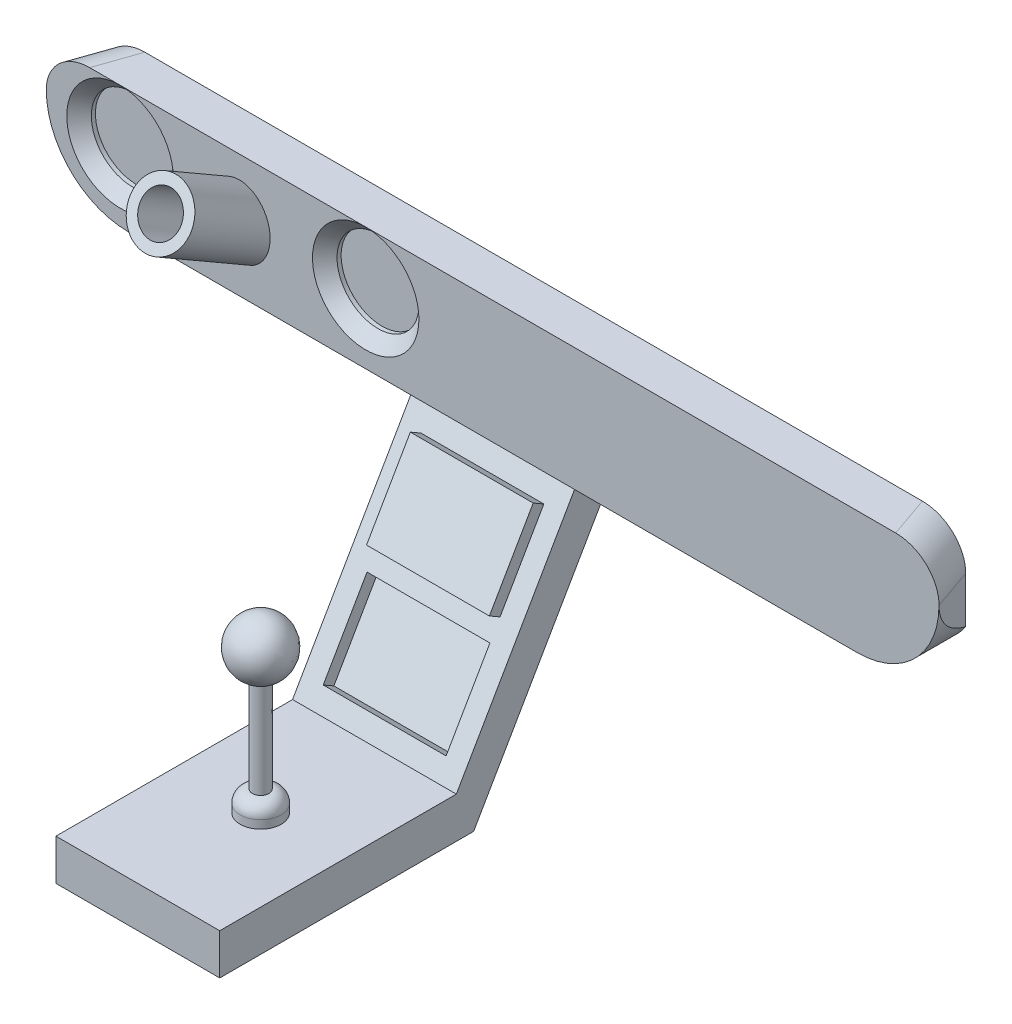
ISO-10303-21;
HEADER;
FILE_DESCRIPTION(('STEP AP214'),'2;1');
FILE_NAME('part.step','',(''),(''),'','','');
FILE_SCHEMA(('AUTOMOTIVE_DESIGN { 1 0 10303 214 1 1 1 1 }'));
ENDSEC;
DATA;
#1=APPLICATION_CONTEXT('core data for automotive mechanical design processes');
#2=APPLICATION_PROTOCOL_DEFINITION('international standard','automotive_design',2000,#1);
#3=PRODUCT_CONTEXT('',#1,'mechanical');
#4=PRODUCT('Part','Part','',(#3));
#5=PRODUCT_RELATED_PRODUCT_CATEGORY('part','',(#4));
#6=PRODUCT_DEFINITION_FORMATION('','',#4);
#7=PRODUCT_DEFINITION_CONTEXT('part definition',#1,'design');
#8=PRODUCT_DEFINITION('design','',#6,#7);
#9=PRODUCT_DEFINITION_SHAPE('','',#8);
#10=(LENGTH_UNIT() NAMED_UNIT(*) SI_UNIT(.MILLI.,.METRE.));
#11=(NAMED_UNIT(*) PLANE_ANGLE_UNIT() SI_UNIT($,.RADIAN.));
#12=(NAMED_UNIT(*) SI_UNIT($,.STERADIAN.) SOLID_ANGLE_UNIT());
#13=UNCERTAINTY_MEASURE_WITH_UNIT(LENGTH_MEASURE(1.E-05),#10,'distance_accuracy_value','');
#14=(GEOMETRIC_REPRESENTATION_CONTEXT(3) GLOBAL_UNCERTAINTY_ASSIGNED_CONTEXT((#13)) GLOBAL_UNIT_ASSIGNED_CONTEXT((#10,
#11,#12)) REPRESENTATION_CONTEXT('',''));
#15=CARTESIAN_POINT('',(0.,0.,0.));
#16=DIRECTION('',(0.,0.,1.));
#17=DIRECTION('',(1.,0.,0.));
#18=AXIS2_PLACEMENT_3D('',#15,#16,#17);
#19=CARTESIAN_POINT('',(109.,15.,5.));
#20=DIRECTION('',(0.,-1.,0.));
#21=DIRECTION('',(1.,0.,0.));
#22=AXIS2_PLACEMENT_3D('',#19,#20,#21);
#23=PLANE('',#22);
#24=DIRECTION('',(-1.,0.,0.));
#25=VECTOR('',#24,1.);
#26=CARTESIAN_POINT('',(109.,15.,5.));
#27=LINE('',#26,#25);
#28=CARTESIAN_POINT('',(98.4117801307302,15.,5.));
#29=VERTEX_POINT('',#28);
#30=CARTESIAN_POINT('',(-31.,15.,5.));
#31=VERTEX_POINT('',#30);
#32=EDGE_CURVE('E217',#29,#31,#27,.T.);
#33=ORIENTED_EDGE('',*,*,#32,.F.);
#34=DIRECTION('',(-0.328667145466067,0.,-0.94444582030479));
#35=VECTOR('',#34,1.);
#36=CARTESIAN_POINT('',(96.0755417969521,15.,-1.71332854533933));
#37=LINE('',#36,#35);
#38=CARTESIAN_POINT('',(94.9317801307302,15.,-5.));
#39=VERTEX_POINT('',#38);
#40=EDGE_CURVE('E199',#29,#39,#37,.T.);
#41=ORIENTED_EDGE('',*,*,#40,.T.);
#42=DIRECTION('',(-1.,0.,0.));
#43=VECTOR('',#42,1.);
#44=CARTESIAN_POINT('',(109.,15.,-5.));
#45=LINE('',#44,#43);
#46=CARTESIAN_POINT('',(-94.9317801307302,15.,-5.));
#47=VERTEX_POINT('',#46);
#48=EDGE_CURVE('E261',#39,#47,#45,.T.);
#49=ORIENTED_EDGE('',*,*,#48,.T.);
#50=DIRECTION('',(0.328667145466067,0.,-0.94444582030479));
#51=VECTOR('',#50,1.);
#52=CARTESIAN_POINT('',(-76.006725630031,15.,-59.3823405192507));
#53=LINE('',#52,#51);
#54=CARTESIAN_POINT('',(-98.4117801307302,15.,5.));
#55=VERTEX_POINT('',#54);
#56=EDGE_CURVE('E254',#47,#55,#53,.F.);
#57=ORIENTED_EDGE('',*,*,#56,.T.);
#58=CARTESIAN_POINT('',(-91.,15.,5.));
#59=VERTEX_POINT('',#58);
#60=EDGE_CURVE('E275',#59,#55,#27,.T.);
#61=ORIENTED_EDGE('',*,*,#60,.F.);
#62=EDGE_CURVE('E274',#31,#59,#27,.T.);
#63=ORIENTED_EDGE('',*,*,#62,.F.);
#64=EDGE_LOOP('',(#33,#41,#49,#57,#61,#63));
#65=FACE_BOUND('',#64,.T.);
#66=ADVANCED_FACE('F41',(#65),#23,.F.);
#67=CARTESIAN_POINT('',(0.,0.,-5.));
#68=DIRECTION('',(0.,0.,1.));
#69=DIRECTION('',(1.,0.,0.));
#70=AXIS2_PLACEMENT_3D('',#67,#68,#69);
#71=PLANE('',#70);
#72=CARTESIAN_POINT('',(-61.85,-4.8867513459481,-5.));
#73=DIRECTION('',(0.,0.,1.));
#74=DIRECTION('',(0.,1.,0.));
#75=AXIS2_PLACEMENT_3D('',#72,#73,#74);
#76=ELLIPSE('',#75,8.66025403784438,7.50000000000001);
#77=CARTESIAN_POINT('',(-61.85,3.77350269189628,-5.));
#78=VERTEX_POINT('',#77);
#79=EDGE_CURVE('E238',#78,#78,#76,.F.);
#80=ORIENTED_EDGE('',*,*,#79,.F.);
#81=EDGE_LOOP('',(#80));
#82=FACE_BOUND('',#81,.T.);
#83=ORIENTED_EDGE('',*,*,#48,.F.);
#84=CARTESIAN_POINT('',(94.9317801307302,5.00000000000001,-5.));
#85=DIRECTION('',(0.,0.,1.));
#86=DIRECTION('',(1.,0.,0.));
#87=AXIS2_PLACEMENT_3D('',#84,#85,#86);
#88=ELLIPSE('',#87,10.5882198692698,10.);
#89=CARTESIAN_POINT('',(105.52,5.00000000000001,-5.));
#90=VERTEX_POINT('',#89);
#91=EDGE_CURVE('E56',#39,#90,#88,.F.);
#92=ORIENTED_EDGE('',*,*,#91,.T.);
#93=DIRECTION('',(0.,1.,0.));
#94=VECTOR('',#93,1.);
#95=CARTESIAN_POINT('',(105.52,-25.,-5.));
#96=LINE('',#95,#94);
#97=CARTESIAN_POINT('',(105.52,-6.27340232582868,-5.));
#98=VERTEX_POINT('',#97);
#99=EDGE_CURVE('E194',#98,#90,#96,.T.);
#100=ORIENTED_EDGE('',*,*,#99,.F.);
#101=CARTESIAN_POINT('',(89.,5.00000000000001,-5.));
#102=DIRECTION('',(0.,0.,1.));
#103=DIRECTION('',(1.,0.,0.));
#104=AXIS2_PLACEMENT_3D('',#101,#102,#103);
#105=CIRCLE('',#104,20.);
#106=CARTESIAN_POINT('',(89.,-15.,-5.));
#107=VERTEX_POINT('',#106);
#108=EDGE_CURVE('E203',#98,#107,#105,.F.);
#109=ORIENTED_EDGE('',*,*,#108,.T.);
#110=DIRECTION('',(1.,0.,0.));
#111=VECTOR('',#110,1.);
#112=CARTESIAN_POINT('',(109.,-15.,-5.));
#113=LINE('',#112,#111);
#114=CARTESIAN_POINT('',(20.,-15.,-5.));
#115=VERTEX_POINT('',#114);
#116=EDGE_CURVE('E271',#115,#107,#113,.T.);
#117=ORIENTED_EDGE('',*,*,#116,.F.);
#118=DIRECTION('',(-1.,0.,0.));
#119=VECTOR('',#118,1.);
#120=CARTESIAN_POINT('',(20.,-15.,-5.));
#121=LINE('',#120,#119);
#122=CARTESIAN_POINT('',(-20.,-15.,-5.));
#123=VERTEX_POINT('',#122);
#124=EDGE_CURVE('E299',#115,#123,#121,.T.);
#125=ORIENTED_EDGE('',*,*,#124,.T.);
#126=CARTESIAN_POINT('',(-89.,-15.,-5.));
#127=VERTEX_POINT('',#126);
#128=EDGE_CURVE('E267',#127,#123,#113,.T.);
#129=ORIENTED_EDGE('',*,*,#128,.F.);
#130=CARTESIAN_POINT('',(-89.,4.99999999999999,-5.));
#131=DIRECTION('',(0.,0.,1.));
#132=DIRECTION('',(1.,0.,0.));
#133=AXIS2_PLACEMENT_3D('',#130,#131,#132);
#134=CIRCLE('',#133,20.);
#135=CARTESIAN_POINT('',(-105.52,-6.27340232582872,-5.));
#136=VERTEX_POINT('',#135);
#137=EDGE_CURVE('E212',#127,#136,#134,.F.);
#138=ORIENTED_EDGE('',*,*,#137,.T.);
#139=DIRECTION('',(0.,1.,0.));
#140=VECTOR('',#139,1.);
#141=CARTESIAN_POINT('',(-105.52,-25.,-5.));
#142=LINE('',#141,#140);
#143=CARTESIAN_POINT('',(-105.52,4.99999999999998,-5.));
#144=VERTEX_POINT('',#143);
#145=EDGE_CURVE('E205',#136,#144,#142,.T.);
#146=ORIENTED_EDGE('',*,*,#145,.T.);
#147=CARTESIAN_POINT('',(-94.9317801307302,4.99999999999998,-5.));
#148=DIRECTION('',(0.,0.,1.));
#149=DIRECTION('',(1.,0.,0.));
#150=AXIS2_PLACEMENT_3D('',#147,#148,#149);
#151=ELLIPSE('',#150,10.5882198692698,10.);
#152=EDGE_CURVE('E251',#144,#47,#151,.F.);
#153=ORIENTED_EDGE('',*,*,#152,.T.);
#154=EDGE_LOOP('',(#83,#92,#100,#109,#117,#125,#129,#138,#146,#153));
#155=FACE_BOUND('',#154,.T.);
#156=ADVANCED_FACE('F202',(#82,#155),#71,.F.);
#157=CARTESIAN_POINT('',(89.,5.00000000000001,5.));
#158=DIRECTION('',(0.,0.,-1.));
#159=DIRECTION('',(-1.,0.,0.));
#160=AXIS2_PLACEMENT_3D('',#157,#158,#159);
#161=CYLINDRICAL_SURFACE('',#160,20.);
#162=ORIENTED_EDGE('',*,*,#108,.F.);
#163=CARTESIAN_POINT('',(89.,5.00000000000001,-52.4712643678162));
#164=DIRECTION('',(0.94444582030479,0.,-0.328667145466067));
#165=DIRECTION('',(-0.328667145466067,0.,-0.94444582030479));
#166=AXIS2_PLACEMENT_3D('',#163,#164,#165);
#167=ELLIPSE('',#166,60.8518383291369,20.);
#168=CARTESIAN_POINT('',(109.,5.00000000000001,5.));
#169=VERTEX_POINT('',#168);
#170=EDGE_CURVE('E192',#98,#169,#167,.F.);
#171=ORIENTED_EDGE('',*,*,#170,.T.);
#172=CARTESIAN_POINT('',(89.,5.00000000000001,5.));
#173=DIRECTION('',(0.,0.,1.));
#174=DIRECTION('',(1.,0.,0.));
#175=AXIS2_PLACEMENT_3D('',#172,#173,#174);
#176=CIRCLE('',#175,20.);
#177=CARTESIAN_POINT('',(89.,-15.,5.));
#178=VERTEX_POINT('',#177);
#179=EDGE_CURVE('E224',#178,#169,#176,.T.);
#180=ORIENTED_EDGE('',*,*,#179,.F.);
#181=DIRECTION('',(0.,0.,-1.));
#182=VECTOR('',#181,1.);
#183=CARTESIAN_POINT('',(89.,-15.,5.));
#184=LINE('',#183,#182);
#185=EDGE_CURVE('E210',#107,#178,#184,.F.);
#186=ORIENTED_EDGE('',*,*,#185,.F.);
#187=EDGE_LOOP('',(#162,#171,#180,#186));
#188=FACE_BOUND('',#187,.T.);
#189=ADVANCED_FACE('F208',(#188),#161,.T.);
#190=CARTESIAN_POINT('',(109.,-15.,5.));
#191=DIRECTION('',(0.,1.,0.));
#192=DIRECTION('',(-1.,0.,0.));
#193=AXIS2_PLACEMENT_3D('',#190,#191,#192);
#194=PLANE('',#193);
#195=DIRECTION('',(0.,0.,1.));
#196=VECTOR('',#195,1.);
#197=CARTESIAN_POINT('',(20.,-15.,-5.));
#198=LINE('',#197,#196);
#199=CARTESIAN_POINT('',(20.,-15.,5.));
#200=VERTEX_POINT('',#199);
#201=EDGE_CURVE('E339',#115,#200,#198,.T.);
#202=ORIENTED_EDGE('',*,*,#201,.F.);
#203=ORIENTED_EDGE('',*,*,#116,.T.);
#204=ORIENTED_EDGE('',*,*,#185,.T.);
#205=DIRECTION('',(1.,0.,0.));
#206=VECTOR('',#205,1.);
#207=CARTESIAN_POINT('',(109.,-15.,5.));
#208=LINE('',#207,#206);
#209=EDGE_CURVE('E266',#200,#178,#208,.T.);
#210=ORIENTED_EDGE('',*,*,#209,.F.);
#211=EDGE_LOOP('',(#202,#203,#204,#210));
#212=FACE_BOUND('',#211,.T.);
#213=ADVANCED_FACE('F473',(#212),#194,.F.);
#214=ORIENTED_EDGE('',*,*,#128,.T.);
#215=DIRECTION('',(0.,0.,1.));
#216=VECTOR('',#215,1.);
#217=CARTESIAN_POINT('',(-20.,-15.,-5.));
#218=LINE('',#217,#216);
#219=CARTESIAN_POINT('',(-20.,-15.,5.));
#220=VERTEX_POINT('',#219);
#221=EDGE_CURVE('E326',#123,#220,#218,.T.);
#222=ORIENTED_EDGE('',*,*,#221,.T.);
#223=CARTESIAN_POINT('',(-89.,-15.,5.));
#224=VERTEX_POINT('',#223);
#225=EDGE_CURVE('E268',#224,#220,#208,.T.);
#226=ORIENTED_EDGE('',*,*,#225,.F.);
#227=DIRECTION('',(0.,0.,-1.));
#228=VECTOR('',#227,1.);
#229=CARTESIAN_POINT('',(-89.,-15.,5.));
#230=LINE('',#229,#228);
#231=EDGE_CURVE('E211',#224,#127,#230,.T.);
#232=ORIENTED_EDGE('',*,*,#231,.T.);
#233=EDGE_LOOP('',(#214,#222,#226,#232));
#234=FACE_BOUND('',#233,.T.);
#235=ADVANCED_FACE('F470',(#234),#194,.F.);
#236=CARTESIAN_POINT('',(0.,0.,5.));
#237=DIRECTION('',(0.,0.,1.));
#238=DIRECTION('',(1.,0.,0.));
#239=AXIS2_PLACEMENT_3D('',#236,#237,#238);
#240=PLANE('',#239);
#241=CARTESIAN_POINT('',(-61.85,0.886751345948122,5.));
#242=DIRECTION('',(0.,0.,1.));
#243=DIRECTION('',(0.,1.,0.));
#244=AXIS2_PLACEMENT_3D('',#241,#242,#243);
#245=ELLIPSE('',#244,8.66025403784438,7.50000000000001);
#246=CARTESIAN_POINT('',(-61.85,9.5470053837925,5.));
#247=VERTEX_POINT('',#246);
#248=EDGE_CURVE('E284',#247,#247,#245,.F.);
#249=ORIENTED_EDGE('',*,*,#248,.T.);
#250=EDGE_LOOP('',(#249));
#251=FACE_BOUND('',#250,.T.);
#252=ORIENTED_EDGE('',*,*,#179,.T.);
#253=CARTESIAN_POINT('',(98.4117801307302,5.00000000000001,5.));
#254=DIRECTION('',(0.,0.,1.));
#255=DIRECTION('',(1.,0.,0.));
#256=AXIS2_PLACEMENT_3D('',#253,#254,#255);
#257=ELLIPSE('',#256,10.5882198692698,10.);
#258=EDGE_CURVE('E11',#169,#29,#257,.T.);
#259=ORIENTED_EDGE('',*,*,#258,.T.);
#260=ORIENTED_EDGE('',*,*,#32,.T.);
#261=CARTESIAN_POINT('',(-31.,2.00000000000004,5.));
#262=DIRECTION('',(0.,0.,1.));
#263=DIRECTION('',(1.,0.,0.));
#264=AXIS2_PLACEMENT_3D('',#261,#262,#263);
#265=CIRCLE('',#264,13.0000000000001);
#266=EDGE_CURVE('E232',#31,#31,#265,.F.);
#267=ORIENTED_EDGE('',*,*,#266,.T.);
#268=ORIENTED_EDGE('',*,*,#62,.T.);
#269=CARTESIAN_POINT('',(-91.,2.00000000000001,5.));
#270=DIRECTION('',(0.,0.,1.));
#271=DIRECTION('',(1.,0.,0.));
#272=AXIS2_PLACEMENT_3D('',#269,#270,#271);
#273=CIRCLE('',#272,13.0000000000001);
#274=EDGE_CURVE('E229',#59,#59,#273,.F.);
#275=ORIENTED_EDGE('',*,*,#274,.T.);
#276=ORIENTED_EDGE('',*,*,#60,.T.);
#277=CARTESIAN_POINT('',(-98.4117801307302,4.99999999999998,5.));
#278=DIRECTION('',(0.,0.,1.));
#279=DIRECTION('',(1.,0.,0.));
#280=AXIS2_PLACEMENT_3D('',#277,#278,#279);
#281=ELLIPSE('',#280,10.5882198692698,10.);
#282=CARTESIAN_POINT('',(-109.,4.99999999999998,5.));
#283=VERTEX_POINT('',#282);
#284=EDGE_CURVE('E200',#55,#283,#281,.T.);
#285=ORIENTED_EDGE('',*,*,#284,.T.);
#286=CARTESIAN_POINT('',(-89.,4.99999999999999,5.));
#287=DIRECTION('',(0.,0.,1.));
#288=DIRECTION('',(1.,0.,0.));
#289=AXIS2_PLACEMENT_3D('',#286,#287,#288);
#290=CIRCLE('',#289,20.);
#291=EDGE_CURVE('E222',#283,#224,#290,.T.);
#292=ORIENTED_EDGE('',*,*,#291,.T.);
#293=ORIENTED_EDGE('',*,*,#225,.T.);
#294=DIRECTION('',(-1.,0.,0.));
#295=VECTOR('',#294,1.);
#296=CARTESIAN_POINT('',(20.,-15.,5.));
#297=LINE('',#296,#295);
#298=EDGE_CURVE('E301',#200,#220,#297,.T.);
#299=ORIENTED_EDGE('',*,*,#298,.F.);
#300=ORIENTED_EDGE('',*,*,#209,.T.);
#301=EDGE_LOOP('',(#252,#259,#260,#267,#268,#275,#276,#285,#292,#293,#299,#300));
#302=FACE_BOUND('',#301,.T.);
#303=ADVANCED_FACE('F435',(#251,#302),#240,.T.);
#304=CARTESIAN_POINT('',(-89.,4.99999999999999,5.));
#305=DIRECTION('',(0.,0.,-1.));
#306=DIRECTION('',(-1.,0.,0.));
#307=AXIS2_PLACEMENT_3D('',#304,#305,#306);
#308=CYLINDRICAL_SURFACE('',#307,20.);
#309=CARTESIAN_POINT('',(-89.,4.99999999999999,-52.4712643678161));
#310=DIRECTION('',(0.94444582030479,0.,0.328667145466067));
#311=DIRECTION('',(0.328667145466067,0.,-0.94444582030479));
#312=AXIS2_PLACEMENT_3D('',#309,#310,#311);
#313=ELLIPSE('',#312,60.8518383291369,20.);
#314=EDGE_CURVE('E245',#136,#283,#313,.F.);
#315=ORIENTED_EDGE('',*,*,#314,.F.);
#316=ORIENTED_EDGE('',*,*,#137,.F.);
#317=ORIENTED_EDGE('',*,*,#231,.F.);
#318=ORIENTED_EDGE('',*,*,#291,.F.);
#319=EDGE_LOOP('',(#315,#316,#317,#318));
#320=FACE_BOUND('',#319,.T.);
#321=ADVANCED_FACE('F426',(#320),#308,.T.);
#322=CARTESIAN_POINT('',(-91.,2.00000000000001,1.));
#323=DIRECTION('',(0.,0.,1.));
#324=DIRECTION('',(1.,0.,0.));
#325=AXIS2_PLACEMENT_3D('',#322,#323,#324);
#326=CYLINDRICAL_SURFACE('',#325,9.99999999999999);
#327=CARTESIAN_POINT('',(-91.,2.00000000000001,1.99999999999995));
#328=DIRECTION('',(0.,0.,1.));
#329=DIRECTION('',(1.,0.,0.));
#330=AXIS2_PLACEMENT_3D('',#327,#328,#329);
#331=CIRCLE('',#330,9.99999999999999);
#332=CARTESIAN_POINT('',(-81.,2.00000000000001,1.99999999999995));
#333=VERTEX_POINT('',#332);
#334=EDGE_CURVE('E235',#333,#333,#331,.T.);
#335=ORIENTED_EDGE('',*,*,#334,.T.);
#336=EDGE_LOOP('',(#335));
#337=FACE_BOUND('',#336,.T.);
#338=CARTESIAN_POINT('',(-91.,2.00000000000001,1.));
#339=DIRECTION('',(0.,0.,1.));
#340=DIRECTION('',(1.,0.,0.));
#341=AXIS2_PLACEMENT_3D('',#338,#339,#340);
#342=CIRCLE('',#341,9.99999999999999);
#343=CARTESIAN_POINT('',(-81.,2.00000000000001,1.));
#344=VERTEX_POINT('',#343);
#345=EDGE_CURVE('E278',#344,#344,#342,.T.);
#346=ORIENTED_EDGE('',*,*,#345,.F.);
#347=EDGE_LOOP('',(#346));
#348=FACE_BOUND('',#347,.T.);
#349=ADVANCED_FACE('F478',(#337,#348),#326,.F.);
#350=CARTESIAN_POINT('',(-91.,2.00000000000001,1.));
#351=DIRECTION('',(0.,0.,1.));
#352=DIRECTION('',(1.,0.,0.));
#353=AXIS2_PLACEMENT_3D('',#350,#351,#352);
#354=PLANE('',#353);
#355=ORIENTED_EDGE('',*,*,#345,.T.);
#356=EDGE_LOOP('',(#355));
#357=FACE_BOUND('',#356,.T.);
#358=ADVANCED_FACE('F449',(#357),#354,.T.);
#359=CARTESIAN_POINT('',(-31.,2.00000000000004,1.));
#360=DIRECTION('',(0.,0.,1.));
#361=DIRECTION('',(1.,0.,0.));
#362=AXIS2_PLACEMENT_3D('',#359,#360,#361);
#363=CYLINDRICAL_SURFACE('',#362,10.);
#364=CARTESIAN_POINT('',(-31.,2.00000000000004,1.99999999999995));
#365=DIRECTION('',(0.,0.,1.));
#366=DIRECTION('',(1.,0.,0.));
#367=AXIS2_PLACEMENT_3D('',#364,#365,#366);
#368=CIRCLE('',#367,10.);
#369=CARTESIAN_POINT('',(-21.,2.00000000000004,1.99999999999995));
#370=VERTEX_POINT('',#369);
#371=EDGE_CURVE('E226',#370,#370,#368,.T.);
#372=ORIENTED_EDGE('',*,*,#371,.T.);
#373=EDGE_LOOP('',(#372));
#374=FACE_BOUND('',#373,.T.);
#375=CARTESIAN_POINT('',(-31.,2.00000000000004,1.));
#376=DIRECTION('',(0.,0.,1.));
#377=DIRECTION('',(1.,0.,0.));
#378=AXIS2_PLACEMENT_3D('',#375,#376,#377);
#379=CIRCLE('',#378,10.);
#380=CARTESIAN_POINT('',(-21.,2.00000000000004,1.));
#381=VERTEX_POINT('',#380);
#382=EDGE_CURVE('E281',#381,#381,#379,.T.);
#383=ORIENTED_EDGE('',*,*,#382,.F.);
#384=EDGE_LOOP('',(#383));
#385=FACE_BOUND('',#384,.T.);
#386=ADVANCED_FACE('F446',(#374,#385),#363,.F.);
#387=CARTESIAN_POINT('',(-31.,2.00000000000004,1.));
#388=DIRECTION('',(0.,0.,1.));
#389=DIRECTION('',(1.,0.,0.));
#390=AXIS2_PLACEMENT_3D('',#387,#388,#389);
#391=PLANE('',#390);
#392=ORIENTED_EDGE('',*,*,#382,.T.);
#393=EDGE_LOOP('',(#392));
#394=FACE_BOUND('',#393,.T.);
#395=ADVANCED_FACE('F442',(#394),#391,.T.);
#396=CARTESIAN_POINT('',(-31.,2.00000000000004,1.99999999999995));
#397=DIRECTION('',(0.,0.,1.));
#398=DIRECTION('',(1.,0.,0.));
#399=AXIS2_PLACEMENT_3D('',#396,#397,#398);
#400=CONICAL_SURFACE('',#399,10.,0.785398163397452);
#401=ORIENTED_EDGE('',*,*,#266,.F.);
#402=EDGE_LOOP('',(#401));
#403=FACE_BOUND('',#402,.T.);
#404=ORIENTED_EDGE('',*,*,#371,.F.);
#405=EDGE_LOOP('',(#404));
#406=FACE_BOUND('',#405,.T.);
#407=ADVANCED_FACE('F438',(#403,#406),#400,.F.);
#408=CARTESIAN_POINT('',(-91.,2.00000000000001,1.99999999999995));
#409=DIRECTION('',(0.,0.,1.));
#410=DIRECTION('',(1.,0.,0.));
#411=AXIS2_PLACEMENT_3D('',#408,#409,#410);
#412=CONICAL_SURFACE('',#411,9.99999999999999,0.785398163397452);
#413=ORIENTED_EDGE('',*,*,#274,.F.);
#414=EDGE_LOOP('',(#413));
#415=FACE_BOUND('',#414,.T.);
#416=ORIENTED_EDGE('',*,*,#334,.F.);
#417=EDGE_LOOP('',(#416));
#418=FACE_BOUND('',#417,.T.);
#419=ADVANCED_FACE('F441',(#415,#418),#412,.F.);
#420=CARTESIAN_POINT('',(-61.85,-1.50480947161665,-14.1423048454133));
#421=DIRECTION('',(0.,0.499999999999998,0.86602540378444));
#422=DIRECTION('',(0.,-0.86602540378444,0.499999999999998));
#423=AXIS2_PLACEMENT_3D('',#420,#421,#422);
#424=PLANE('',#423);
#425=CARTESIAN_POINT('',(-61.85,-7.99999999999997,-10.3923048454133));
#426=DIRECTION('',(0.,0.499999999999998,0.86602540378444));
#427=DIRECTION('',(0.,-0.86602540378444,0.499999999999998));
#428=AXIS2_PLACEMENT_3D('',#425,#426,#427);
#429=CIRCLE('',#428,5.);
#430=CARTESIAN_POINT('',(-61.85,-12.3301270189222,-7.89230484541329));
#431=VERTEX_POINT('',#430);
#432=EDGE_CURVE('E293',#431,#431,#429,.T.);
#433=ORIENTED_EDGE('',*,*,#432,.T.);
#434=EDGE_LOOP('',(#433));
#435=FACE_BOUND('',#434,.T.);
#436=CARTESIAN_POINT('',(-61.85,-7.99999999999997,-10.3923048454133));
#437=DIRECTION('',(0.,0.499999999999998,0.86602540378444));
#438=DIRECTION('',(0.,-0.86602540378444,0.499999999999998));
#439=AXIS2_PLACEMENT_3D('',#436,#437,#438);
#440=CIRCLE('',#439,7.50000000000001);
#441=CARTESIAN_POINT('',(-61.85,-14.4951905283833,-6.6423048454133));
#442=VERTEX_POINT('',#441);
#443=EDGE_CURVE('E287',#442,#442,#440,.T.);
#444=ORIENTED_EDGE('',*,*,#443,.F.);
#445=EDGE_LOOP('',(#444));
#446=FACE_BOUND('',#445,.T.);
#447=ADVANCED_FACE('F487',(#435,#446),#424,.F.);
#448=CARTESIAN_POINT('',(-61.85,11.9999999999999,24.2487113059643));
#449=DIRECTION('',(0.,0.499999999999998,0.86602540378444));
#450=DIRECTION('',(0.,-0.86602540378444,0.499999999999998));
#451=AXIS2_PLACEMENT_3D('',#448,#449,#450);
#452=CYLINDRICAL_SURFACE('',#451,7.50000000000001);
#453=ORIENTED_EDGE('',*,*,#443,.T.);
#454=EDGE_LOOP('',(#453));
#455=FACE_BOUND('',#454,.T.);
#456=ORIENTED_EDGE('',*,*,#79,.T.);
#457=EDGE_LOOP('',(#456));
#458=FACE_BOUND('',#457,.T.);
#459=ADVANCED_FACE('F600',(#455,#458),#452,.T.);
#460=ORIENTED_EDGE('',*,*,#248,.F.);
#461=EDGE_LOOP('',(#460));
#462=FACE_BOUND('',#461,.T.);
#463=CARTESIAN_POINT('',(-61.85,11.9999999999999,24.2487113059643));
#464=DIRECTION('',(0.,0.499999999999998,0.86602540378444));
#465=DIRECTION('',(0.,-0.86602540378444,0.499999999999998));
#466=AXIS2_PLACEMENT_3D('',#463,#464,#465);
#467=CIRCLE('',#466,7.5);
#468=CARTESIAN_POINT('',(-61.85,5.50480947161664,27.9987113059643));
#469=VERTEX_POINT('',#468);
#470=EDGE_CURVE('E290',#469,#469,#467,.T.);
#471=ORIENTED_EDGE('',*,*,#470,.F.);
#472=EDGE_LOOP('',(#471));
#473=FACE_BOUND('',#472,.T.);
#474=ADVANCED_FACE('F597',(#462,#473),#452,.T.);
#475=CARTESIAN_POINT('',(-61.85,18.4951905283832,20.4987113059643));
#476=DIRECTION('',(0.,-0.499999999999998,-0.86602540378444));
#477=DIRECTION('',(0.,0.86602540378444,-0.499999999999998));
#478=AXIS2_PLACEMENT_3D('',#475,#476,#477);
#479=PLANE('',#478);
#480=CARTESIAN_POINT('',(-61.85,12.,24.2487113059643));
#481=DIRECTION('',(0.,0.499999999999998,0.86602540378444));
#482=DIRECTION('',(0.,-0.86602540378444,0.499999999999998));
#483=AXIS2_PLACEMENT_3D('',#480,#481,#482);
#484=CIRCLE('',#483,5.);
#485=CARTESIAN_POINT('',(-61.85,7.66987298107775,26.7487113059643));
#486=VERTEX_POINT('',#485);
#487=EDGE_CURVE('E296',#486,#486,#484,.T.);
#488=ORIENTED_EDGE('',*,*,#487,.F.);
#489=EDGE_LOOP('',(#488));
#490=FACE_BOUND('',#489,.T.);
#491=ORIENTED_EDGE('',*,*,#470,.T.);
#492=EDGE_LOOP('',(#491));
#493=FACE_BOUND('',#492,.T.);
#494=ADVANCED_FACE('F593',(#490,#493),#479,.F.);
#495=CARTESIAN_POINT('',(-61.85,-11.3737976320958,-16.2358937586588));
#496=DIRECTION('',(0.,0.499999999999998,0.86602540378444));
#497=DIRECTION('',(0.,-0.86602540378444,0.499999999999998));
#498=AXIS2_PLACEMENT_3D('',#495,#496,#497);
#499=CYLINDRICAL_SURFACE('',#498,5.);
#500=ORIENTED_EDGE('',*,*,#487,.T.);
#501=EDGE_LOOP('',(#500));
#502=FACE_BOUND('',#501,.T.);
#503=ORIENTED_EDGE('',*,*,#432,.F.);
#504=EDGE_LOOP('',(#503));
#505=FACE_BOUND('',#504,.T.);
#506=ADVANCED_FACE('F589',(#502,#505),#499,.F.);
#507=CARTESIAN_POINT('',(20.,-15.,-5.));
#508=DIRECTION('',(0.,0.499999999999998,0.86602540378444));
#509=DIRECTION('',(0.,-0.86602540378444,0.499999999999998));
#510=AXIS2_PLACEMENT_3D('',#507,#508,#509);
#511=PLANE('',#510);
#512=DIRECTION('',(0.,0.86602540378444,-0.499999999999998));
#513=VECTOR('',#512,1.);
#514=CARTESIAN_POINT('',(-20.,-15.,-5.));
#515=LINE('',#514,#513);
#516=CARTESIAN_POINT('',(-20.,-75.,29.6410161513773));
#517=VERTEX_POINT('',#516);
#518=EDGE_CURVE('E328',#517,#123,#515,.T.);
#519=ORIENTED_EDGE('',*,*,#518,.T.);
#520=ORIENTED_EDGE('',*,*,#124,.F.);
#521=DIRECTION('',(0.,0.86602540378444,-0.499999999999998));
#522=VECTOR('',#521,1.);
#523=CARTESIAN_POINT('',(20.,-15.,-5.));
#524=LINE('',#523,#522);
#525=CARTESIAN_POINT('',(20.,-75.,29.6410161513773));
#526=VERTEX_POINT('',#525);
#527=EDGE_CURVE('E319',#526,#115,#524,.T.);
#528=ORIENTED_EDGE('',*,*,#527,.F.);
#529=DIRECTION('',(-1.,0.,0.));
#530=VECTOR('',#529,1.);
#531=CARTESIAN_POINT('',(20.,-75.,29.6410161513773));
#532=LINE('',#531,#530);
#533=EDGE_CURVE('E313',#526,#517,#532,.T.);
#534=ORIENTED_EDGE('',*,*,#533,.T.);
#535=EDGE_LOOP('',(#519,#520,#528,#534));
#536=FACE_BOUND('',#535,.T.);
#537=ADVANCED_FACE('F585',(#536),#511,.F.);
#538=CARTESIAN_POINT('',(20.,-15.,5.));
#539=DIRECTION('',(0.,-0.499999999999998,-0.86602540378444));
#540=DIRECTION('',(0.,0.86602540378444,-0.499999999999998));
#541=AXIS2_PLACEMENT_3D('',#538,#539,#540);
#542=PLANE('',#541);
#543=DIRECTION('',(1.,0.,0.));
#544=VECTOR('',#543,1.);
#545=CARTESIAN_POINT('',(15.,-60.6698729810778,31.3675134594811));
#546=LINE('',#545,#544);
#547=CARTESIAN_POINT('',(-15.,-60.6698729810778,31.3675134594811));
#548=VERTEX_POINT('',#547);
#549=CARTESIAN_POINT('',(15.,-60.6698729810778,31.3675134594811));
#550=VERTEX_POINT('',#549);
#551=EDGE_CURVE('E390',#548,#550,#546,.T.);
#552=ORIENTED_EDGE('',*,*,#551,.F.);
#553=DIRECTION('',(0.,-0.86602540378444,0.499999999999998));
#554=VECTOR('',#553,1.);
#555=CARTESIAN_POINT('',(-15.,-60.6698729810778,31.3675134594811));
#556=LINE('',#555,#554);
#557=CARTESIAN_POINT('',(-15.,-42.1369293400907,20.6675134594812));
#558=VERTEX_POINT('',#557);
#559=EDGE_CURVE('E393',#558,#548,#556,.T.);
#560=ORIENTED_EDGE('',*,*,#559,.F.);
#561=DIRECTION('',(-1.,0.,0.));
#562=VECTOR('',#561,1.);
#563=CARTESIAN_POINT('',(15.,-42.1369293400907,20.6675134594812));
#564=LINE('',#563,#562);
#565=CARTESIAN_POINT('',(15.,-42.1369293400907,20.6675134594812));
#566=VERTEX_POINT('',#565);
#567=EDGE_CURVE('E383',#566,#558,#564,.T.);
#568=ORIENTED_EDGE('',*,*,#567,.F.);
#569=DIRECTION('',(0.,0.86602540378444,-0.499999999999998));
#570=VECTOR('',#569,1.);
#571=CARTESIAN_POINT('',(15.,-60.6698729810778,31.3675134594811));
#572=LINE('',#571,#570);
#573=EDGE_CURVE('E387',#550,#566,#572,.T.);
#574=ORIENTED_EDGE('',*,*,#573,.F.);
#575=EDGE_LOOP('',(#552,#560,#568,#574));
#576=FACE_BOUND('',#575,.T.);
#577=DIRECTION('',(-1.,0.,0.));
#578=VECTOR('',#577,1.);
#579=CARTESIAN_POINT('',(15.,-19.3301270189222,7.5));
#580=LINE('',#579,#578);
#581=CARTESIAN_POINT('',(15.,-19.3301270189222,7.5));
#582=VERTEX_POINT('',#581);
#583=CARTESIAN_POINT('',(-15.,-19.3301270189222,7.5));
#584=VERTEX_POINT('',#583);
#585=EDGE_CURVE('E354',#582,#584,#580,.T.);
#586=ORIENTED_EDGE('',*,*,#585,.F.);
#587=DIRECTION('',(0.,-0.86602540378444,0.499999999999998));
#588=VECTOR('',#587,1.);
#589=CARTESIAN_POINT('',(15.,-19.3301270189222,7.5));
#590=LINE('',#589,#588);
#591=CARTESIAN_POINT('',(15.,-37.8630706599092,18.1999999999999));
#592=VERTEX_POINT('',#591);
#593=EDGE_CURVE('E362',#582,#592,#590,.T.);
#594=ORIENTED_EDGE('',*,*,#593,.T.);
#595=DIRECTION('',(-1.,0.,0.));
#596=VECTOR('',#595,1.);
#597=CARTESIAN_POINT('',(15.,-37.8630706599092,18.1999999999999));
#598=LINE('',#597,#596);
#599=CARTESIAN_POINT('',(-15.,-37.8630706599092,18.2));
#600=VERTEX_POINT('',#599);
#601=EDGE_CURVE('E359',#592,#600,#598,.T.);
#602=ORIENTED_EDGE('',*,*,#601,.T.);
#603=DIRECTION('',(0.,-0.86602540378444,0.499999999999998));
#604=VECTOR('',#603,1.);
#605=CARTESIAN_POINT('',(-15.,-19.3301270189222,7.5));
#606=LINE('',#605,#604);
#607=EDGE_CURVE('E357',#584,#600,#606,.T.);
#608=ORIENTED_EDGE('',*,*,#607,.F.);
#609=EDGE_LOOP('',(#586,#594,#602,#608));
#610=FACE_BOUND('',#609,.T.);
#611=DIRECTION('',(0.,-0.86602540378444,0.499999999999998));
#612=VECTOR('',#611,1.);
#613=CARTESIAN_POINT('',(-20.,-15.,5.));
#614=LINE('',#613,#612);
#615=CARTESIAN_POINT('',(-20.,-65.,33.8675134594811));
#616=VERTEX_POINT('',#615);
#617=EDGE_CURVE('E324',#220,#616,#614,.T.);
#618=ORIENTED_EDGE('',*,*,#617,.T.);
#619=DIRECTION('',(-1.,0.,0.));
#620=VECTOR('',#619,1.);
#621=CARTESIAN_POINT('',(20.,-65.,33.8675134594811));
#622=LINE('',#621,#620);
#623=CARTESIAN_POINT('',(20.,-65.,33.8675134594811));
#624=VERTEX_POINT('',#623);
#625=EDGE_CURVE('E304',#624,#616,#622,.T.);
#626=ORIENTED_EDGE('',*,*,#625,.F.);
#627=DIRECTION('',(0.,-0.86602540378444,0.499999999999998));
#628=VECTOR('',#627,1.);
#629=CARTESIAN_POINT('',(20.,-15.,5.));
#630=LINE('',#629,#628);
#631=EDGE_CURVE('E337',#200,#624,#630,.T.);
#632=ORIENTED_EDGE('',*,*,#631,.F.);
#633=ORIENTED_EDGE('',*,*,#298,.T.);
#634=EDGE_LOOP('',(#618,#626,#632,#633));
#635=FACE_BOUND('',#634,.T.);
#636=ADVANCED_FACE('F581',(#576,#610,#635),#542,.F.);
#637=CARTESIAN_POINT('',(20.,-65.,33.8675134594811));
#638=DIRECTION('',(0.,-1.,0.));
#639=DIRECTION('',(0.,0.,-1.));
#640=AXIS2_PLACEMENT_3D('',#637,#638,#639);
#641=PLANE('',#640);
#642=CARTESIAN_POINT('',(0.,-65.,61.6410161513773));
#643=DIRECTION('',(0.,-1.,0.));
#644=DIRECTION('',(0.,0.,-1.));
#645=AXIS2_PLACEMENT_3D('',#642,#643,#644);
#646=CIRCLE('',#645,5.);
#647=CARTESIAN_POINT('',(0.,-65.,56.6410161513773));
#648=VERTEX_POINT('',#647);
#649=EDGE_CURVE('E244',#648,#648,#646,.F.);
#650=ORIENTED_EDGE('',*,*,#649,.F.);
#651=EDGE_LOOP('',(#650));
#652=FACE_BOUND('',#651,.T.);
#653=DIRECTION('',(0.,0.,1.));
#654=VECTOR('',#653,1.);
#655=CARTESIAN_POINT('',(-20.,-65.,33.8675134594811));
#656=LINE('',#655,#654);
#657=CARTESIAN_POINT('',(-20.,-65.,91.6410161513773));
#658=VERTEX_POINT('',#657);
#659=EDGE_CURVE('E322',#616,#658,#656,.T.);
#660=ORIENTED_EDGE('',*,*,#659,.T.);
#661=DIRECTION('',(-1.,0.,0.));
#662=VECTOR('',#661,1.);
#663=CARTESIAN_POINT('',(20.,-65.,91.6410161513773));
#664=LINE('',#663,#662);
#665=CARTESIAN_POINT('',(20.,-65.,91.6410161513773));
#666=VERTEX_POINT('',#665);
#667=EDGE_CURVE('E307',#666,#658,#664,.T.);
#668=ORIENTED_EDGE('',*,*,#667,.F.);
#669=DIRECTION('',(0.,0.,1.));
#670=VECTOR('',#669,1.);
#671=CARTESIAN_POINT('',(20.,-65.,33.8675134594811));
#672=LINE('',#671,#670);
#673=EDGE_CURVE('E335',#624,#666,#672,.T.);
#674=ORIENTED_EDGE('',*,*,#673,.F.);
#675=ORIENTED_EDGE('',*,*,#625,.T.);
#676=EDGE_LOOP('',(#660,#668,#674,#675));
#677=FACE_BOUND('',#676,.T.);
#678=ADVANCED_FACE('F577',(#652,#677),#641,.F.);
#679=CARTESIAN_POINT('',(20.,-65.,91.6410161513773));
#680=DIRECTION('',(0.,0.,-1.));
#681=DIRECTION('',(0.,1.,0.));
#682=AXIS2_PLACEMENT_3D('',#679,#680,#681);
#683=PLANE('',#682);
#684=DIRECTION('',(0.,-1.,0.));
#685=VECTOR('',#684,1.);
#686=CARTESIAN_POINT('',(-20.,-65.,91.6410161513773));
#687=LINE('',#686,#685);
#688=CARTESIAN_POINT('',(-20.,-75.,91.6410161513773));
#689=VERTEX_POINT('',#688);
#690=EDGE_CURVE('E320',#658,#689,#687,.T.);
#691=ORIENTED_EDGE('',*,*,#690,.T.);
#692=DIRECTION('',(-1.,0.,0.));
#693=VECTOR('',#692,1.);
#694=CARTESIAN_POINT('',(20.,-75.,91.6410161513773));
#695=LINE('',#694,#693);
#696=CARTESIAN_POINT('',(20.,-75.,91.6410161513773));
#697=VERTEX_POINT('',#696);
#698=EDGE_CURVE('E310',#697,#689,#695,.T.);
#699=ORIENTED_EDGE('',*,*,#698,.F.);
#700=DIRECTION('',(0.,-1.,0.));
#701=VECTOR('',#700,1.);
#702=CARTESIAN_POINT('',(20.,-65.,91.6410161513773));
#703=LINE('',#702,#701);
#704=EDGE_CURVE('E333',#666,#697,#703,.T.);
#705=ORIENTED_EDGE('',*,*,#704,.F.);
#706=ORIENTED_EDGE('',*,*,#667,.T.);
#707=EDGE_LOOP('',(#691,#699,#705,#706));
#708=FACE_BOUND('',#707,.T.);
#709=ADVANCED_FACE('F573',(#708),#683,.F.);
#710=CARTESIAN_POINT('',(20.,-75.,29.6410161513773));
#711=DIRECTION('',(0.,1.,0.));
#712=DIRECTION('',(0.,0.,1.));
#713=AXIS2_PLACEMENT_3D('',#710,#711,#712);
#714=PLANE('',#713);
#715=CARTESIAN_POINT('',(0.,-75.,61.6410161513773));
#716=DIRECTION('',(0.,1.,0.));
#717=DIRECTION('',(0.,0.,1.));
#718=AXIS2_PLACEMENT_3D('',#715,#716,#717);
#719=CIRCLE('',#718,7.49999999999999);
#720=CARTESIAN_POINT('',(0.,-75.,69.1410161513773));
#721=VERTEX_POINT('',#720);
#722=EDGE_CURVE('E241',#721,#721,#719,.F.);
#723=ORIENTED_EDGE('',*,*,#722,.F.);
#724=EDGE_LOOP('',(#723));
#725=FACE_BOUND('',#724,.T.);
#726=DIRECTION('',(0.,0.,-1.));
#727=VECTOR('',#726,1.);
#728=CARTESIAN_POINT('',(-20.,-75.,29.6410161513773));
#729=LINE('',#728,#727);
#730=EDGE_CURVE('E317',#689,#517,#729,.T.);
#731=ORIENTED_EDGE('',*,*,#730,.T.);
#732=ORIENTED_EDGE('',*,*,#533,.F.);
#733=DIRECTION('',(0.,0.,-1.));
#734=VECTOR('',#733,1.);
#735=CARTESIAN_POINT('',(20.,-75.,29.6410161513773));
#736=LINE('',#735,#734);
#737=EDGE_CURVE('E316',#697,#526,#736,.T.);
#738=ORIENTED_EDGE('',*,*,#737,.F.);
#739=ORIENTED_EDGE('',*,*,#698,.T.);
#740=EDGE_LOOP('',(#731,#732,#738,#739));
#741=FACE_BOUND('',#740,.T.);
#742=ADVANCED_FACE('F566',(#725,#741),#714,.F.);
#743=CARTESIAN_POINT('',(20.,0.,0.));
#744=DIRECTION('',(-1.,0.,0.));
#745=DIRECTION('',(0.,0.,1.));
#746=AXIS2_PLACEMENT_3D('',#743,#744,#745);
#747=PLANE('',#746);
#748=ORIENTED_EDGE('',*,*,#527,.T.);
#749=ORIENTED_EDGE('',*,*,#201,.T.);
#750=ORIENTED_EDGE('',*,*,#631,.T.);
#751=ORIENTED_EDGE('',*,*,#673,.T.);
#752=ORIENTED_EDGE('',*,*,#704,.T.);
#753=ORIENTED_EDGE('',*,*,#737,.T.);
#754=EDGE_LOOP('',(#748,#749,#750,#751,#752,#753));
#755=FACE_BOUND('',#754,.T.);
#756=ADVANCED_FACE('F563',(#755),#747,.F.);
#757=CARTESIAN_POINT('',(-20.,0.,0.));
#758=DIRECTION('',(-1.,0.,0.));
#759=DIRECTION('',(0.,0.,1.));
#760=AXIS2_PLACEMENT_3D('',#757,#758,#759);
#761=PLANE('',#760);
#762=ORIENTED_EDGE('',*,*,#518,.F.);
#763=ORIENTED_EDGE('',*,*,#730,.F.);
#764=ORIENTED_EDGE('',*,*,#690,.F.);
#765=ORIENTED_EDGE('',*,*,#659,.F.);
#766=ORIENTED_EDGE('',*,*,#617,.F.);
#767=ORIENTED_EDGE('',*,*,#221,.F.);
#768=EDGE_LOOP('',(#762,#763,#764,#765,#766,#767));
#769=FACE_BOUND('',#768,.T.);
#770=ADVANCED_FACE('F561',(#769),#761,.T.);
#771=CARTESIAN_POINT('',(15.,-17.8301270189222,10.0980762113533));
#772=DIRECTION('',(1.,0.,0.));
#773=DIRECTION('',(0.,1.,0.));
#774=AXIS2_PLACEMENT_3D('',#771,#772,#773);
#775=PLANE('',#774);
#776=ORIENTED_EDGE('',*,*,#593,.F.);
#777=DIRECTION('',(0.,-0.499999999999998,-0.86602540378444));
#778=VECTOR('',#777,1.);
#779=CARTESIAN_POINT('',(15.,-17.8301270189222,10.0980762113533));
#780=LINE('',#779,#778);
#781=CARTESIAN_POINT('',(15.,-17.8301270189222,10.0980762113533));
#782=VERTEX_POINT('',#781);
#783=EDGE_CURVE('E331',#782,#582,#780,.T.);
#784=ORIENTED_EDGE('',*,*,#783,.F.);
#785=DIRECTION('',(0.,-0.86602540378444,0.499999999999998));
#786=VECTOR('',#785,1.);
#787=CARTESIAN_POINT('',(15.,-17.8301270189222,10.0980762113533));
#788=LINE('',#787,#786);
#789=CARTESIAN_POINT('',(15.,-36.3630706599092,20.7980762113533));
#790=VERTEX_POINT('',#789);
#791=EDGE_CURVE('E356',#782,#790,#788,.T.);
#792=ORIENTED_EDGE('',*,*,#791,.T.);
#793=DIRECTION('',(0.,-0.499999999999998,-0.86602540378444));
#794=VECTOR('',#793,1.);
#795=CARTESIAN_POINT('',(15.,-36.3630706599092,20.7980762113533));
#796=LINE('',#795,#794);
#797=EDGE_CURVE('E344',#790,#592,#796,.T.);
#798=ORIENTED_EDGE('',*,*,#797,.T.);
#799=EDGE_LOOP('',(#776,#784,#792,#798));
#800=FACE_BOUND('',#799,.T.);
#801=ADVANCED_FACE('F551',(#800),#775,.T.);
#802=CARTESIAN_POINT('',(15.,-17.8301270189222,10.0980762113533));
#803=DIRECTION('',(0.,-0.86602540378444,0.499999999999998));
#804=DIRECTION('',(0.,-0.499999999999998,-0.86602540378444));
#805=AXIS2_PLACEMENT_3D('',#802,#803,#804);
#806=PLANE('',#805);
#807=ORIENTED_EDGE('',*,*,#585,.T.);
#808=DIRECTION('',(0.,-0.499999999999998,-0.86602540378444));
#809=VECTOR('',#808,1.);
#810=CARTESIAN_POINT('',(-15.,-17.8301270189222,10.0980762113533));
#811=LINE('',#810,#809);
#812=CARTESIAN_POINT('',(-15.,-17.8301270189222,10.0980762113533));
#813=VERTEX_POINT('',#812);
#814=EDGE_CURVE('E350',#813,#584,#811,.T.);
#815=ORIENTED_EDGE('',*,*,#814,.F.);
#816=DIRECTION('',(-1.,0.,0.));
#817=VECTOR('',#816,1.);
#818=CARTESIAN_POINT('',(15.,-17.8301270189222,10.0980762113533));
#819=LINE('',#818,#817);
#820=EDGE_CURVE('E347',#782,#813,#819,.T.);
#821=ORIENTED_EDGE('',*,*,#820,.F.);
#822=ORIENTED_EDGE('',*,*,#783,.T.);
#823=EDGE_LOOP('',(#807,#815,#821,#822));
#824=FACE_BOUND('',#823,.T.);
#825=ADVANCED_FACE('F547',(#824),#806,.F.);
#826=CARTESIAN_POINT('',(-15.,-17.8301270189222,10.0980762113533));
#827=DIRECTION('',(1.,0.,0.));
#828=DIRECTION('',(0.,1.,0.));
#829=AXIS2_PLACEMENT_3D('',#826,#827,#828);
#830=PLANE('',#829);
#831=ORIENTED_EDGE('',*,*,#607,.T.);
#832=DIRECTION('',(0.,-0.499999999999998,-0.86602540378444));
#833=VECTOR('',#832,1.);
#834=CARTESIAN_POINT('',(-15.,-36.3630706599092,20.7980762113533));
#835=LINE('',#834,#833);
#836=CARTESIAN_POINT('',(-15.,-36.3630706599092,20.7980762113533));
#837=VERTEX_POINT('',#836);
#838=EDGE_CURVE('E346',#837,#600,#835,.T.);
#839=ORIENTED_EDGE('',*,*,#838,.F.);
#840=DIRECTION('',(0.,-0.86602540378444,0.499999999999998));
#841=VECTOR('',#840,1.);
#842=CARTESIAN_POINT('',(-15.,-17.8301270189222,10.0980762113533));
#843=LINE('',#842,#841);
#844=EDGE_CURVE('E367',#813,#837,#843,.T.);
#845=ORIENTED_EDGE('',*,*,#844,.F.);
#846=ORIENTED_EDGE('',*,*,#814,.T.);
#847=EDGE_LOOP('',(#831,#839,#845,#846));
#848=FACE_BOUND('',#847,.T.);
#849=ADVANCED_FACE('F550',(#848),#830,.F.);
#850=CARTESIAN_POINT('',(15.,-36.3630706599092,20.7980762113533));
#851=DIRECTION('',(0.,-0.86602540378444,0.499999999999998));
#852=DIRECTION('',(0.,-0.499999999999998,-0.86602540378444));
#853=AXIS2_PLACEMENT_3D('',#850,#851,#852);
#854=PLANE('',#853);
#855=ORIENTED_EDGE('',*,*,#601,.F.);
#856=ORIENTED_EDGE('',*,*,#797,.F.);
#857=DIRECTION('',(-1.,0.,0.));
#858=VECTOR('',#857,1.);
#859=CARTESIAN_POINT('',(15.,-36.3630706599092,20.7980762113533));
#860=LINE('',#859,#858);
#861=EDGE_CURVE('E369',#790,#837,#860,.T.);
#862=ORIENTED_EDGE('',*,*,#861,.T.);
#863=ORIENTED_EDGE('',*,*,#838,.T.);
#864=EDGE_LOOP('',(#855,#856,#862,#863));
#865=FACE_BOUND('',#864,.T.);
#866=ADVANCED_FACE('F545',(#865),#854,.T.);
#867=CARTESIAN_POINT('',(0.,-0.0849364905388817,-0.147114317029938));
#868=DIRECTION('',(0.,-0.499999999999998,-0.86602540378444));
#869=DIRECTION('',(0.,0.86602540378444,-0.499999999999998));
#870=AXIS2_PLACEMENT_3D('',#867,#868,#869);
#871=PLANE('',#870);
#872=ORIENTED_EDGE('',*,*,#791,.F.);
#873=ORIENTED_EDGE('',*,*,#820,.T.);
#874=ORIENTED_EDGE('',*,*,#844,.T.);
#875=ORIENTED_EDGE('',*,*,#861,.F.);
#876=EDGE_LOOP('',(#872,#873,#874,#875));
#877=FACE_BOUND('',#876,.T.);
#878=ADVANCED_FACE('F541',(#877),#871,.F.);
#879=CARTESIAN_POINT('',(-15.,-62.1698729810778,28.7694372481278));
#880=DIRECTION('',(-1.,0.,0.));
#881=DIRECTION('',(0.,-1.,0.));
#882=AXIS2_PLACEMENT_3D('',#879,#880,#881);
#883=PLANE('',#882);
#884=ORIENTED_EDGE('',*,*,#559,.T.);
#885=DIRECTION('',(0.,0.499999999999998,0.86602540378444));
#886=VECTOR('',#885,1.);
#887=CARTESIAN_POINT('',(-15.,-62.1698729810778,28.7694372481278));
#888=LINE('',#887,#886);
#889=CARTESIAN_POINT('',(-15.,-62.1698729810778,28.7694372481278));
#890=VERTEX_POINT('',#889);
#891=EDGE_CURVE('E374',#890,#548,#888,.T.);
#892=ORIENTED_EDGE('',*,*,#891,.F.);
#893=DIRECTION('',(0.,-0.86602540378444,0.499999999999998));
#894=VECTOR('',#893,1.);
#895=CARTESIAN_POINT('',(-15.,-62.1698729810778,28.7694372481278));
#896=LINE('',#895,#894);
#897=CARTESIAN_POINT('',(-15.,-43.6369293400907,18.0694372481278));
#898=VERTEX_POINT('',#897);
#899=EDGE_CURVE('E386',#898,#890,#896,.T.);
#900=ORIENTED_EDGE('',*,*,#899,.F.);
#901=DIRECTION('',(0.,0.499999999999998,0.86602540378444));
#902=VECTOR('',#901,1.);
#903=CARTESIAN_POINT('',(-15.,-43.6369293400907,18.0694372481278));
#904=LINE('',#903,#902);
#905=EDGE_CURVE('E365',#898,#558,#904,.T.);
#906=ORIENTED_EDGE('',*,*,#905,.T.);
#907=EDGE_LOOP('',(#884,#892,#900,#906));
#908=FACE_BOUND('',#907,.T.);
#909=ADVANCED_FACE('F531',(#908),#883,.F.);
#910=CARTESIAN_POINT('',(15.,-43.6369293400907,18.0694372481278));
#911=DIRECTION('',(0.,0.86602540378444,-0.499999999999998));
#912=DIRECTION('',(0.,0.499999999999998,0.86602540378444));
#913=AXIS2_PLACEMENT_3D('',#910,#911,#912);
#914=PLANE('',#913);
#915=ORIENTED_EDGE('',*,*,#567,.T.);
#916=ORIENTED_EDGE('',*,*,#905,.F.);
#917=DIRECTION('',(-1.,0.,0.));
#918=VECTOR('',#917,1.);
#919=CARTESIAN_POINT('',(15.,-43.6369293400907,18.0694372481278));
#920=LINE('',#919,#918);
#921=CARTESIAN_POINT('',(15.,-43.6369293400907,18.0694372481278));
#922=VERTEX_POINT('',#921);
#923=EDGE_CURVE('E378',#922,#898,#920,.T.);
#924=ORIENTED_EDGE('',*,*,#923,.F.);
#925=DIRECTION('',(0.,0.499999999999998,0.86602540378444));
#926=VECTOR('',#925,1.);
#927=CARTESIAN_POINT('',(15.,-43.6369293400907,18.0694372481278));
#928=LINE('',#927,#926);
#929=EDGE_CURVE('E380',#922,#566,#928,.T.);
#930=ORIENTED_EDGE('',*,*,#929,.T.);
#931=EDGE_LOOP('',(#915,#916,#924,#930));
#932=FACE_BOUND('',#931,.T.);
#933=ADVANCED_FACE('F527',(#932),#914,.F.);
#934=CARTESIAN_POINT('',(15.,-62.1698729810778,28.7694372481278));
#935=DIRECTION('',(1.,0.,0.));
#936=DIRECTION('',(0.,1.,0.));
#937=AXIS2_PLACEMENT_3D('',#934,#935,#936);
#938=PLANE('',#937);
#939=ORIENTED_EDGE('',*,*,#573,.T.);
#940=ORIENTED_EDGE('',*,*,#929,.F.);
#941=DIRECTION('',(0.,0.86602540378444,-0.499999999999998));
#942=VECTOR('',#941,1.);
#943=CARTESIAN_POINT('',(15.,-62.1698729810778,28.7694372481278));
#944=LINE('',#943,#942);
#945=CARTESIAN_POINT('',(15.,-62.1698729810778,28.7694372481278));
#946=VERTEX_POINT('',#945);
#947=EDGE_CURVE('E398',#946,#922,#944,.T.);
#948=ORIENTED_EDGE('',*,*,#947,.F.);
#949=DIRECTION('',(0.,0.499999999999998,0.86602540378444));
#950=VECTOR('',#949,1.);
#951=CARTESIAN_POINT('',(15.,-62.1698729810778,28.7694372481278));
#952=LINE('',#951,#950);
#953=EDGE_CURVE('E377',#946,#550,#952,.T.);
#954=ORIENTED_EDGE('',*,*,#953,.T.);
#955=EDGE_LOOP('',(#939,#940,#948,#954));
#956=FACE_BOUND('',#955,.T.);
#957=ADVANCED_FACE('F530',(#956),#938,.F.);
#958=CARTESIAN_POINT('',(15.,-62.1698729810778,28.7694372481278));
#959=DIRECTION('',(0.,-0.86602540378444,0.499999999999998));
#960=DIRECTION('',(0.,-0.499999999999998,-0.86602540378444));
#961=AXIS2_PLACEMENT_3D('',#958,#959,#960);
#962=PLANE('',#961);
#963=ORIENTED_EDGE('',*,*,#551,.T.);
#964=ORIENTED_EDGE('',*,*,#953,.F.);
#965=DIRECTION('',(1.,0.,0.));
#966=VECTOR('',#965,1.);
#967=CARTESIAN_POINT('',(15.,-62.1698729810778,28.7694372481278));
#968=LINE('',#967,#966);
#969=EDGE_CURVE('E401',#890,#946,#968,.T.);
#970=ORIENTED_EDGE('',*,*,#969,.F.);
#971=ORIENTED_EDGE('',*,*,#891,.T.);
#972=EDGE_LOOP('',(#963,#964,#970,#971));
#973=FACE_BOUND('',#972,.T.);
#974=ADVANCED_FACE('F525',(#973),#962,.F.);
#975=CARTESIAN_POINT('',(0.,-3.08493649053887,-5.34326673973658));
#976=DIRECTION('',(0.,0.499999999999998,0.86602540378444));
#977=DIRECTION('',(0.,-0.86602540378444,0.499999999999998));
#978=AXIS2_PLACEMENT_3D('',#975,#976,#977);
#979=PLANE('',#978);
#980=ORIENTED_EDGE('',*,*,#899,.T.);
#981=ORIENTED_EDGE('',*,*,#969,.T.);
#982=ORIENTED_EDGE('',*,*,#947,.T.);
#983=ORIENTED_EDGE('',*,*,#923,.T.);
#984=EDGE_LOOP('',(#980,#981,#982,#983));
#985=FACE_BOUND('',#984,.T.);
#986=ADVANCED_FACE('F507',(#985),#979,.T.);
#987=CARTESIAN_POINT('',(0.,-85.,61.6410161513773));
#988=DIRECTION('',(0.,1.,0.));
#989=DIRECTION('',(0.,0.,1.));
#990=AXIS2_PLACEMENT_3D('',#987,#988,#989);
#991=PLANE('',#990);
#992=CARTESIAN_POINT('',(0.,-85.,61.6410161513773));
#993=DIRECTION('',(0.,1.,0.));
#994=DIRECTION('',(0.,0.,1.));
#995=AXIS2_PLACEMENT_3D('',#992,#993,#994);
#996=CIRCLE('',#995,7.5);
#997=CARTESIAN_POINT('',(0.,-85.,69.1410161513773));
#998=VERTEX_POINT('',#997);
#999=EDGE_CURVE('E416',#998,#998,#996,.T.);
#1000=ORIENTED_EDGE('',*,*,#999,.F.);
#1001=EDGE_LOOP('',(#1000));
#1002=FACE_BOUND('',#1001,.T.);
#1003=ADVANCED_FACE('F503',(#1002),#991,.F.);
#1004=CARTESIAN_POINT('',(0.,-23.0811887800857,61.6410161513773));
#1005=DIRECTION('',(0.,1.,0.));
#1006=DIRECTION('',(0.,0.,1.));
#1007=AXIS2_PLACEMENT_3D('',#1004,#1005,#1006);
#1008=CYLINDRICAL_SURFACE('',#1007,7.49999999999999);
#1009=ORIENTED_EDGE('',*,*,#722,.T.);
#1010=EDGE_LOOP('',(#1009));
#1011=FACE_BOUND('',#1010,.T.);
#1012=ORIENTED_EDGE('',*,*,#999,.T.);
#1013=EDGE_LOOP('',(#1012));
#1014=FACE_BOUND('',#1013,.T.);
#1015=ADVANCED_FACE('F506',(#1011,#1014),#1008,.T.);
#1016=CARTESIAN_POINT('',(0.,-23.0811887800857,61.6410161513773));
#1017=DIRECTION('',(0.,1.,0.));
#1018=DIRECTION('',(0.,0.,1.));
#1019=AXIS2_PLACEMENT_3D('',#1016,#1017,#1018);
#1020=CYLINDRICAL_SURFACE('',#1019,5.);
#1021=CARTESIAN_POINT('',(0.,-63.,61.6410161513773));
#1022=DIRECTION('',(0.,1.,0.));
#1023=DIRECTION('',(0.,0.,1.));
#1024=AXIS2_PLACEMENT_3D('',#1021,#1022,#1023);
#1025=CIRCLE('',#1024,5.);
#1026=CARTESIAN_POINT('',(0.,-63.,66.6410161513773));
#1027=VERTEX_POINT('',#1026);
#1028=EDGE_CURVE('E413',#1027,#1027,#1025,.T.);
#1029=ORIENTED_EDGE('',*,*,#1028,.F.);
#1030=EDGE_LOOP('',(#1029));
#1031=FACE_BOUND('',#1030,.T.);
#1032=ORIENTED_EDGE('',*,*,#649,.T.);
#1033=EDGE_LOOP('',(#1032));
#1034=FACE_BOUND('',#1033,.T.);
#1035=ADVANCED_FACE('F511',(#1031,#1034),#1020,.T.);
#1036=CARTESIAN_POINT('',(0.,-30.,61.5127535177389));
#1037=DIRECTION('',(-1.,0.,0.));
#1038=DIRECTION('',(0.,0.,1.));
#1039=AXIS2_PLACEMENT_3D('',#1036,#1037,#1038);
#1040=CIRCLE('',#1039,6.92);
#1041=TRIMMED_CURVE('',#1040,(PARAMETER_VALUE(-1.55226020268396)),
(PARAMETER_VALUE(1.55226020268396)),.T.,.PARAMETER.);
#1042=CARTESIAN_POINT('',(0.,-30.,61.6410161513773));
#1043=DIRECTION('',(0.,1.,0.));
#1044=AXIS1_PLACEMENT('',#1042,#1043);
#1045=SURFACE_OF_REVOLUTION('',#1041,#1044);
#1046=CARTESIAN_POINT('',(0.,-23.0811887800857,61.6410161513773));
#1047=VERTEX_POINT('',#1046);
#1048=VERTEX_LOOP('',#1047);
#1049=FACE_BOUND('',#1048,.T.);
#1050=CARTESIAN_POINT('',(0.,-36.5845955200193,61.6410161513773));
#1051=DIRECTION('',(0.,1.,0.));
#1052=DIRECTION('',(0.,0.,1.));
#1053=AXIS2_PLACEMENT_3D('',#1050,#1051,#1052);
#1054=CIRCLE('',#1053,2.);
#1055=CARTESIAN_POINT('',(0.,-36.5845955200193,63.6410161513773));
#1056=VERTEX_POINT('',#1055);
#1057=EDGE_CURVE('E395',#1056,#1056,#1054,.T.);
#1058=ORIENTED_EDGE('',*,*,#1057,.T.);
#1059=EDGE_LOOP('',(#1058));
#1060=FACE_BOUND('',#1059,.T.);
#1061=ADVANCED_FACE('F514',(#1049,#1060),#1045,.T.);
#1062=CARTESIAN_POINT('',(0.,-23.0811887800857,61.6410161513773));
#1063=DIRECTION('',(0.,1.,0.));
#1064=DIRECTION('',(0.,0.,1.));
#1065=AXIS2_PLACEMENT_3D('',#1062,#1063,#1064);
#1066=CYLINDRICAL_SURFACE('',#1065,2.);
#1067=ORIENTED_EDGE('',*,*,#1057,.F.);
#1068=EDGE_LOOP('',(#1067));
#1069=FACE_BOUND('',#1068,.T.);
#1070=CARTESIAN_POINT('',(0.,-60.,61.6410161513773));
#1071=DIRECTION('',(0.,1.,0.));
#1072=DIRECTION('',(0.,0.,1.));
#1073=AXIS2_PLACEMENT_3D('',#1070,#1071,#1072);
#1074=CIRCLE('',#1073,2.);
#1075=CARTESIAN_POINT('',(0.,-60.,63.6410161513773));
#1076=VERTEX_POINT('',#1075);
#1077=EDGE_CURVE('E410',#1076,#1076,#1074,.T.);
#1078=ORIENTED_EDGE('',*,*,#1077,.T.);
#1079=EDGE_LOOP('',(#1078));
#1080=FACE_BOUND('',#1079,.T.);
#1081=ADVANCED_FACE('F499',(#1069,#1080),#1066,.T.);
#1082=CARTESIAN_POINT('',(0.,-63.,61.6410161513773));
#1083=DIRECTION('',(0.,1.,0.));
#1084=DIRECTION('',(0.,0.,1.));
#1085=AXIS2_PLACEMENT_3D('',#1082,#1083,#1084);
#1086=DEGENERATE_TOROIDAL_SURFACE('',#1085,2.00000000000001,3.,.T.);
#1087=ORIENTED_EDGE('',*,*,#1077,.F.);
#1088=EDGE_LOOP('',(#1087));
#1089=FACE_BOUND('',#1088,.T.);
#1090=ORIENTED_EDGE('',*,*,#1028,.T.);
#1091=EDGE_LOOP('',(#1090));
#1092=FACE_BOUND('',#1091,.T.);
#1093=ADVANCED_FACE('F494',(#1089,#1092),#1086,.T.);
#1094=CARTESIAN_POINT('',(-105.52,-25.,-5.));
#1095=DIRECTION('',(0.94444582030479,0.,0.328667145466067));
#1096=DIRECTION('',(0.328667145466067,0.,-0.94444582030479));
#1097=AXIS2_PLACEMENT_3D('',#1094,#1095,#1096);
#1098=PLANE('',#1097);
#1099=ORIENTED_EDGE('',*,*,#314,.T.);
#1100=DIRECTION('',(0.328667145466067,0.,-0.94444582030479));
#1101=VECTOR('',#1100,1.);
#1102=CARTESIAN_POINT('',(-105.52,4.99999999999998,-5.));
#1103=LINE('',#1102,#1101);
#1104=EDGE_CURVE('E248',#283,#144,#1103,.T.);
#1105=ORIENTED_EDGE('',*,*,#1104,.T.);
#1106=ORIENTED_EDGE('',*,*,#145,.F.);
#1107=EDGE_LOOP('',(#1099,#1105,#1106));
#1108=FACE_BOUND('',#1107,.T.);
#1109=ADVANCED_FACE('F422',(#1108),#1098,.F.);
#1110=CARTESIAN_POINT('',(-96.0755417969521,4.99999999999998,-1.71332854533933));
#1111=DIRECTION('',(0.328667145466067,0.,-0.94444582030479));
#1112=DIRECTION('',(-0.94444582030479,0.,-0.328667145466067));
#1113=AXIS2_PLACEMENT_3D('',#1110,#1111,#1112);
#1114=CYLINDRICAL_SURFACE('',#1113,10.);
#1115=ORIENTED_EDGE('',*,*,#284,.F.);
#1116=ORIENTED_EDGE('',*,*,#56,.F.);
#1117=ORIENTED_EDGE('',*,*,#152,.F.);
#1118=ORIENTED_EDGE('',*,*,#1104,.F.);
#1119=EDGE_LOOP('',(#1115,#1116,#1117,#1118));
#1120=FACE_BOUND('',#1119,.T.);
#1121=ADVANCED_FACE('F431',(#1120),#1114,.T.);
#1122=CARTESIAN_POINT('',(105.52,-25.,-5.));
#1123=DIRECTION('',(0.94444582030479,0.,-0.328667145466067));
#1124=DIRECTION('',(-0.328667145466067,0.,-0.94444582030479));
#1125=AXIS2_PLACEMENT_3D('',#1122,#1123,#1124);
#1126=PLANE('',#1125);
#1127=ORIENTED_EDGE('',*,*,#99,.T.);
#1128=DIRECTION('',(-0.328667145466067,0.,-0.94444582030479));
#1129=VECTOR('',#1128,1.);
#1130=CARTESIAN_POINT('',(109.,5.00000000000001,5.));
#1131=LINE('',#1130,#1129);
#1132=EDGE_CURVE('E49',#90,#169,#1131,.F.);
#1133=ORIENTED_EDGE('',*,*,#1132,.T.);
#1134=ORIENTED_EDGE('',*,*,#170,.F.);
#1135=EDGE_LOOP('',(#1127,#1133,#1134));
#1136=FACE_BOUND('',#1135,.T.);
#1137=ADVANCED_FACE('F193',(#1136),#1126,.T.);
#1138=CARTESIAN_POINT('',(99.5555417969521,5.00000000000001,8.28667145466067));
#1139=DIRECTION('',(0.328667145466067,0.,0.94444582030479));
#1140=DIRECTION('',(0.94444582030479,0.,-0.328667145466067));
#1141=AXIS2_PLACEMENT_3D('',#1138,#1139,#1140);
#1142=CYLINDRICAL_SURFACE('',#1141,10.);
#1143=ORIENTED_EDGE('',*,*,#258,.F.);
#1144=ORIENTED_EDGE('',*,*,#1132,.F.);
#1145=ORIENTED_EDGE('',*,*,#91,.F.);
#1146=ORIENTED_EDGE('',*,*,#40,.F.);
#1147=EDGE_LOOP('',(#1143,#1144,#1145,#1146));
#1148=FACE_BOUND('',#1147,.T.);
#1149=ADVANCED_FACE('F43',(#1148),#1142,.T.);
#1150=CLOSED_SHELL('',(#66,#156,#189,#213,#235,#303,#321,#349,#358,#386,#395,#407,#419,#447,
#459,#474,#494,#506,#537,#636,#678,#709,#742,#756,#770,#801,#825,#849,#866,#878,#909,#933,#957,
#974,#986,#1003,#1015,#1035,#1061,#1081,#1093,#1109,#1121,#1137,#1149));
#1151=MANIFOLD_SOLID_BREP('B2',#1150);
#1152=ADVANCED_BREP_SHAPE_REPRESENTATION('',(#18,#1151),#14);
#1153=SHAPE_DEFINITION_REPRESENTATION(#9,#1152);
ENDSEC;
END-ISO-10303-21;
